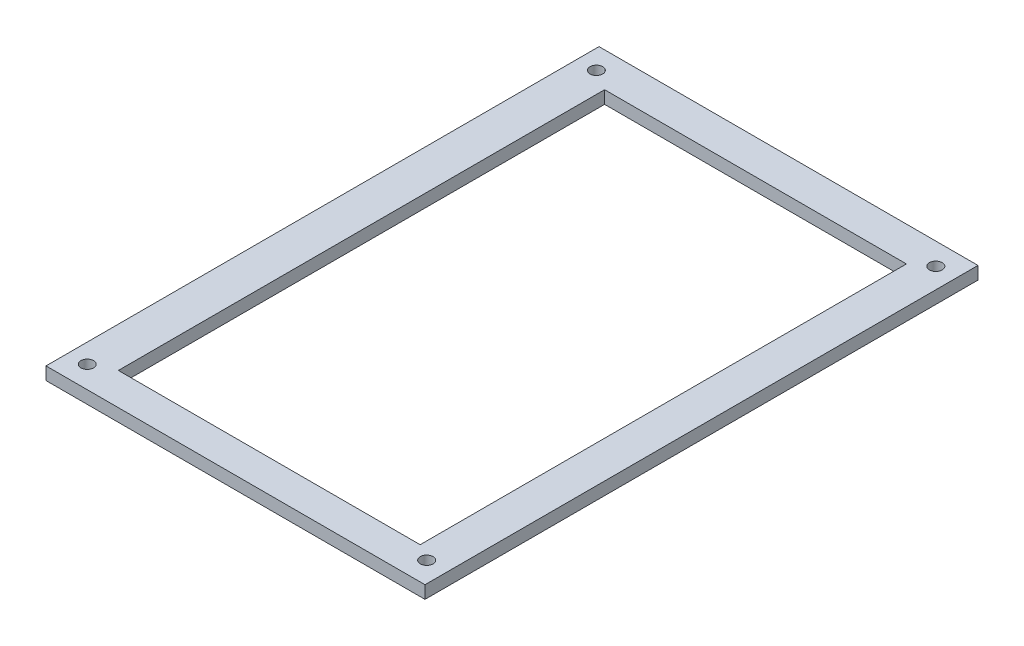
ISO-10303-21;
HEADER;
FILE_DESCRIPTION(('STEP AP214'),'2;1');
FILE_NAME('part.step','',(''),(''),'','','');
FILE_SCHEMA(('AUTOMOTIVE_DESIGN { 1 0 10303 214 1 1 1 1 }'));
ENDSEC;
DATA;
#1=APPLICATION_CONTEXT('core data for automotive mechanical design processes');
#2=APPLICATION_PROTOCOL_DEFINITION('international standard','automotive_design',2000,#1);
#3=PRODUCT_CONTEXT('',#1,'mechanical');
#4=PRODUCT('Part','Part','',(#3));
#5=PRODUCT_RELATED_PRODUCT_CATEGORY('part','',(#4));
#6=PRODUCT_DEFINITION_FORMATION('','',#4);
#7=PRODUCT_DEFINITION_CONTEXT('part definition',#1,'design');
#8=PRODUCT_DEFINITION('design','',#6,#7);
#9=PRODUCT_DEFINITION_SHAPE('','',#8);
#10=(LENGTH_UNIT() NAMED_UNIT(*) SI_UNIT(.MILLI.,.METRE.));
#11=(NAMED_UNIT(*) PLANE_ANGLE_UNIT() SI_UNIT($,.RADIAN.));
#12=(NAMED_UNIT(*) SI_UNIT($,.STERADIAN.) SOLID_ANGLE_UNIT());
#13=UNCERTAINTY_MEASURE_WITH_UNIT(LENGTH_MEASURE(1.E-05),#10,'distance_accuracy_value','');
#14=(GEOMETRIC_REPRESENTATION_CONTEXT(3) GLOBAL_UNCERTAINTY_ASSIGNED_CONTEXT((#13)) GLOBAL_UNIT_ASSIGNED_CONTEXT((#10,
#11,#12)) REPRESENTATION_CONTEXT('',''));
#15=CARTESIAN_POINT('',(0.,0.,0.));
#16=DIRECTION('',(0.,0.,1.));
#17=DIRECTION('',(1.,0.,0.));
#18=AXIS2_PLACEMENT_3D('',#15,#16,#17);
#19=CARTESIAN_POINT('',(0.,42.,0.));
#20=DIRECTION('',(0.,-1.,0.));
#21=DIRECTION('',(0.,0.,-1.));
#22=AXIS2_PLACEMENT_3D('',#19,#20,#21);
#23=PLANE('',#22);
#24=DIRECTION('',(1.,0.,0.));
#25=VECTOR('',#24,1.);
#26=CARTESIAN_POINT('',(13.4246740856766,42.,-63.4018424092195));
#27=LINE('',#26,#25);
#28=CARTESIAN_POINT('',(13.4246740856766,42.,-63.4018424092195));
#29=VERTEX_POINT('',#28);
#30=CARTESIAN_POINT('',(84.5608782991245,42.,-63.4018424092195));
#31=VERTEX_POINT('',#30);
#32=EDGE_CURVE('E228',#29,#31,#27,.T.);
#33=ORIENTED_EDGE('',*,*,#32,.F.);
#34=DIRECTION('',(0.,0.,1.));
#35=VECTOR('',#34,1.);
#36=CARTESIAN_POINT('',(13.4246740856766,42.,-178.010171419774));
#37=LINE('',#36,#35);
#38=CARTESIAN_POINT('',(13.4246740856766,42.,-178.010171419774));
#39=VERTEX_POINT('',#38);
#40=EDGE_CURVE('E169',#39,#29,#37,.T.);
#41=ORIENTED_EDGE('',*,*,#40,.F.);
#42=DIRECTION('',(-1.,0.,0.));
#43=VECTOR('',#42,1.);
#44=CARTESIAN_POINT('',(13.4246740856766,42.,-178.010171419774));
#45=LINE('',#44,#43);
#46=CARTESIAN_POINT('',(84.5608782991245,42.,-178.010171419774));
#47=VERTEX_POINT('',#46);
#48=EDGE_CURVE('E236',#47,#39,#45,.T.);
#49=ORIENTED_EDGE('',*,*,#48,.F.);
#50=DIRECTION('',(0.,0.,-1.));
#51=VECTOR('',#50,1.);
#52=CARTESIAN_POINT('',(84.5608782991245,42.,-178.010171419774));
#53=LINE('',#52,#51);
#54=EDGE_CURVE('E232',#31,#47,#53,.T.);
#55=ORIENTED_EDGE('',*,*,#54,.F.);
#56=EDGE_LOOP('',(#33,#41,#49,#55));
#57=FACE_BOUND('',#56,.T.);
#58=CARTESIAN_POINT('',(88.5,42.,-61.));
#59=DIRECTION('',(0.,1.,0.));
#60=DIRECTION('',(0.,0.,1.));
#61=AXIS2_PLACEMENT_3D('',#58,#59,#60);
#62=CIRCLE('',#61,1.5);
#63=CARTESIAN_POINT('',(88.5,42.,-59.5));
#64=VERTEX_POINT('',#63);
#65=EDGE_CURVE('E52',#64,#64,#62,.T.);
#66=ORIENTED_EDGE('',*,*,#65,.F.);
#67=EDGE_LOOP('',(#66));
#68=FACE_BOUND('',#67,.T.);
#69=CARTESIAN_POINT('',(8.49999999999999,42.,-181.));
#70=DIRECTION('',(0.,1.,0.));
#71=DIRECTION('',(0.,0.,1.));
#72=AXIS2_PLACEMENT_3D('',#69,#70,#71);
#73=CIRCLE('',#72,1.5);
#74=CARTESIAN_POINT('',(8.49999999999999,42.,-179.5));
#75=VERTEX_POINT('',#74);
#76=EDGE_CURVE('E142',#75,#75,#73,.T.);
#77=ORIENTED_EDGE('',*,*,#76,.F.);
#78=EDGE_LOOP('',(#77));
#79=FACE_BOUND('',#78,.T.);
#80=CARTESIAN_POINT('',(88.5,42.,-181.));
#81=DIRECTION('',(0.,1.,0.));
#82=DIRECTION('',(0.,0.,1.));
#83=AXIS2_PLACEMENT_3D('',#80,#81,#82);
#84=CIRCLE('',#83,1.5);
#85=CARTESIAN_POINT('',(88.5,42.,-179.5));
#86=VERTEX_POINT('',#85);
#87=EDGE_CURVE('E146',#86,#86,#84,.T.);
#88=ORIENTED_EDGE('',*,*,#87,.F.);
#89=EDGE_LOOP('',(#88));
#90=FACE_BOUND('',#89,.T.);
#91=CARTESIAN_POINT('',(8.49999999999999,42.,-61.));
#92=DIRECTION('',(0.,1.,0.));
#93=DIRECTION('',(0.,0.,1.));
#94=AXIS2_PLACEMENT_3D('',#91,#92,#93);
#95=CIRCLE('',#94,1.5);
#96=CARTESIAN_POINT('',(8.49999999999999,42.,-59.5));
#97=VERTEX_POINT('',#96);
#98=EDGE_CURVE('E153',#97,#97,#95,.T.);
#99=ORIENTED_EDGE('',*,*,#98,.F.);
#100=EDGE_LOOP('',(#99));
#101=FACE_BOUND('',#100,.T.);
#102=DIRECTION('',(0.,0.,1.));
#103=VECTOR('',#102,1.);
#104=CARTESIAN_POINT('',(3.97136320231542,42.,-186.145726622208));
#105=LINE('',#104,#103);
#106=CARTESIAN_POINT('',(3.97136320231542,42.,-186.145726622208));
#107=VERTEX_POINT('',#106);
#108=CARTESIAN_POINT('',(3.97136320231542,42.,-55.8051978447658));
#109=VERTEX_POINT('',#108);
#110=EDGE_CURVE('E185',#107,#109,#105,.T.);
#111=ORIENTED_EDGE('',*,*,#110,.T.);
#112=DIRECTION('',(1.,0.,0.));
#113=VECTOR('',#112,1.);
#114=CARTESIAN_POINT('',(3.97136320231542,42.,-55.8051978447658));
#115=LINE('',#114,#113);
#116=CARTESIAN_POINT('',(93.2956416651782,42.,-55.8051978447658));
#117=VERTEX_POINT('',#116);
#118=EDGE_CURVE('E127',#109,#117,#115,.T.);
#119=ORIENTED_EDGE('',*,*,#118,.T.);
#120=DIRECTION('',(0.,0.,-1.));
#121=VECTOR('',#120,1.);
#122=CARTESIAN_POINT('',(93.2956416651782,42.,-186.145726622208));
#123=LINE('',#122,#121);
#124=CARTESIAN_POINT('',(93.2956416651782,42.,-186.145726622208));
#125=VERTEX_POINT('',#124);
#126=EDGE_CURVE('E138',#117,#125,#123,.T.);
#127=ORIENTED_EDGE('',*,*,#126,.T.);
#128=DIRECTION('',(-1.,0.,0.));
#129=VECTOR('',#128,1.);
#130=CARTESIAN_POINT('',(3.97136320231542,42.,-186.145726622208));
#131=LINE('',#130,#129);
#132=EDGE_CURVE('E131',#125,#107,#131,.T.);
#133=ORIENTED_EDGE('',*,*,#132,.T.);
#134=EDGE_LOOP('',(#111,#119,#127,#133));
#135=FACE_BOUND('',#134,.T.);
#136=ADVANCED_FACE('F44',(#57,#68,#79,#90,#101,#135),#23,.F.);
#137=CARTESIAN_POINT('',(88.5,39.,-61.));
#138=DIRECTION('',(0.,1.,0.));
#139=DIRECTION('',(0.,0.,1.));
#140=AXIS2_PLACEMENT_3D('',#137,#138,#139);
#141=CYLINDRICAL_SURFACE('',#140,1.5);
#142=CARTESIAN_POINT('',(88.5,39.,-61.));
#143=DIRECTION('',(0.,1.,0.));
#144=DIRECTION('',(0.,0.,1.));
#145=AXIS2_PLACEMENT_3D('',#142,#143,#144);
#146=CIRCLE('',#145,1.5);
#147=CARTESIAN_POINT('',(88.5,39.,-59.5));
#148=VERTEX_POINT('',#147);
#149=EDGE_CURVE('E151',#148,#148,#146,.T.);
#150=ORIENTED_EDGE('',*,*,#149,.F.);
#151=EDGE_LOOP('',(#150));
#152=FACE_BOUND('',#151,.T.);
#153=ORIENTED_EDGE('',*,*,#65,.T.);
#154=EDGE_LOOP('',(#153));
#155=FACE_BOUND('',#154,.T.);
#156=ADVANCED_FACE('F174',(#152,#155),#141,.F.);
#157=CARTESIAN_POINT('',(8.49999999999999,39.,-181.));
#158=DIRECTION('',(0.,1.,0.));
#159=DIRECTION('',(0.,0.,1.));
#160=AXIS2_PLACEMENT_3D('',#157,#158,#159);
#161=CYLINDRICAL_SURFACE('',#160,1.5);
#162=CARTESIAN_POINT('',(8.49999999999999,39.,-181.));
#163=DIRECTION('',(0.,1.,0.));
#164=DIRECTION('',(0.,0.,1.));
#165=AXIS2_PLACEMENT_3D('',#162,#163,#164);
#166=CIRCLE('',#165,1.5);
#167=CARTESIAN_POINT('',(8.49999999999999,39.,-179.5));
#168=VERTEX_POINT('',#167);
#169=EDGE_CURVE('E147',#168,#168,#166,.T.);
#170=ORIENTED_EDGE('',*,*,#169,.F.);
#171=EDGE_LOOP('',(#170));
#172=FACE_BOUND('',#171,.T.);
#173=ORIENTED_EDGE('',*,*,#76,.T.);
#174=EDGE_LOOP('',(#173));
#175=FACE_BOUND('',#174,.T.);
#176=ADVANCED_FACE('F284',(#172,#175),#161,.F.);
#177=CARTESIAN_POINT('',(88.5,39.,-181.));
#178=DIRECTION('',(0.,1.,0.));
#179=DIRECTION('',(0.,0.,1.));
#180=AXIS2_PLACEMENT_3D('',#177,#178,#179);
#181=CYLINDRICAL_SURFACE('',#180,1.5);
#182=CARTESIAN_POINT('',(88.5,39.,-181.));
#183=DIRECTION('',(0.,1.,0.));
#184=DIRECTION('',(0.,0.,1.));
#185=AXIS2_PLACEMENT_3D('',#182,#183,#184);
#186=CIRCLE('',#185,1.5);
#187=CARTESIAN_POINT('',(88.5,39.,-179.5));
#188=VERTEX_POINT('',#187);
#189=EDGE_CURVE('E152',#188,#188,#186,.T.);
#190=ORIENTED_EDGE('',*,*,#189,.F.);
#191=EDGE_LOOP('',(#190));
#192=FACE_BOUND('',#191,.T.);
#193=ORIENTED_EDGE('',*,*,#87,.T.);
#194=EDGE_LOOP('',(#193));
#195=FACE_BOUND('',#194,.T.);
#196=ADVANCED_FACE('F287',(#192,#195),#181,.F.);
#197=CARTESIAN_POINT('',(8.49999999999999,39.,-61.));
#198=DIRECTION('',(0.,1.,0.));
#199=DIRECTION('',(0.,0.,1.));
#200=AXIS2_PLACEMENT_3D('',#197,#198,#199);
#201=CYLINDRICAL_SURFACE('',#200,1.5);
#202=CARTESIAN_POINT('',(8.49999999999999,39.,-61.));
#203=DIRECTION('',(0.,1.,0.));
#204=DIRECTION('',(0.,0.,1.));
#205=AXIS2_PLACEMENT_3D('',#202,#203,#204);
#206=CIRCLE('',#205,1.5);
#207=CARTESIAN_POINT('',(8.49999999999999,39.,-59.5));
#208=VERTEX_POINT('',#207);
#209=EDGE_CURVE('E157',#208,#208,#206,.T.);
#210=ORIENTED_EDGE('',*,*,#209,.F.);
#211=EDGE_LOOP('',(#210));
#212=FACE_BOUND('',#211,.T.);
#213=ORIENTED_EDGE('',*,*,#98,.T.);
#214=EDGE_LOOP('',(#213));
#215=FACE_BOUND('',#214,.T.);
#216=ADVANCED_FACE('F283',(#212,#215),#201,.F.);
#217=CARTESIAN_POINT('',(3.97136320231542,0.,-186.145726622208));
#218=DIRECTION('',(-1.,0.,0.));
#219=DIRECTION('',(0.,0.,1.));
#220=AXIS2_PLACEMENT_3D('',#217,#218,#219);
#221=PLANE('',#220);
#222=DIRECTION('',(0.,0.,-1.));
#223=VECTOR('',#222,1.);
#224=CARTESIAN_POINT('',(3.97136320231542,39.,-55.8051978447658));
#225=LINE('',#224,#223);
#226=CARTESIAN_POINT('',(3.97136320231542,39.,-55.8051978447658));
#227=VERTEX_POINT('',#226);
#228=CARTESIAN_POINT('',(3.97136320231542,39.,-186.145726622208));
#229=VERTEX_POINT('',#228);
#230=EDGE_CURVE('E108',#227,#229,#225,.T.);
#231=ORIENTED_EDGE('',*,*,#230,.F.);
#232=DIRECTION('',(0.,1.,0.));
#233=VECTOR('',#232,1.);
#234=CARTESIAN_POINT('',(3.97136320231542,0.,-55.8051978447658));
#235=LINE('',#234,#233);
#236=EDGE_CURVE('E120',#227,#109,#235,.T.);
#237=ORIENTED_EDGE('',*,*,#236,.T.);
#238=ORIENTED_EDGE('',*,*,#110,.F.);
#239=DIRECTION('',(0.,1.,0.));
#240=VECTOR('',#239,1.);
#241=CARTESIAN_POINT('',(3.97136320231542,0.,-186.145726622208));
#242=LINE('',#241,#240);
#243=EDGE_CURVE('E122',#229,#107,#242,.T.);
#244=ORIENTED_EDGE('',*,*,#243,.F.);
#245=EDGE_LOOP('',(#231,#237,#238,#244));
#246=FACE_BOUND('',#245,.T.);
#247=ADVANCED_FACE('F118',(#246),#221,.T.);
#248=CARTESIAN_POINT('',(3.97136320231542,0.,-186.145726622208));
#249=DIRECTION('',(0.,0.,-1.));
#250=DIRECTION('',(-1.,0.,0.));
#251=AXIS2_PLACEMENT_3D('',#248,#249,#250);
#252=PLANE('',#251);
#253=DIRECTION('',(1.,0.,0.));
#254=VECTOR('',#253,1.);
#255=CARTESIAN_POINT('',(93.2956416651782,39.,-186.145726622208));
#256=LINE('',#255,#254);
#257=CARTESIAN_POINT('',(93.2956416651782,39.,-186.145726622208));
#258=VERTEX_POINT('',#257);
#259=EDGE_CURVE('E114',#229,#258,#256,.T.);
#260=ORIENTED_EDGE('',*,*,#259,.F.);
#261=ORIENTED_EDGE('',*,*,#243,.T.);
#262=ORIENTED_EDGE('',*,*,#132,.F.);
#263=DIRECTION('',(0.,1.,0.));
#264=VECTOR('',#263,1.);
#265=CARTESIAN_POINT('',(93.2956416651782,0.,-186.145726622208));
#266=LINE('',#265,#264);
#267=EDGE_CURVE('E135',#258,#125,#266,.T.);
#268=ORIENTED_EDGE('',*,*,#267,.F.);
#269=EDGE_LOOP('',(#260,#261,#262,#268));
#270=FACE_BOUND('',#269,.T.);
#271=ADVANCED_FACE('F209',(#270),#252,.T.);
#272=CARTESIAN_POINT('',(93.2956416651782,0.,-186.145726622208));
#273=DIRECTION('',(1.,0.,0.));
#274=DIRECTION('',(0.,0.,-1.));
#275=AXIS2_PLACEMENT_3D('',#272,#273,#274);
#276=PLANE('',#275);
#277=DIRECTION('',(0.,0.,-1.));
#278=VECTOR('',#277,1.);
#279=CARTESIAN_POINT('',(93.2956416651782,39.,-55.8051978447658));
#280=LINE('',#279,#278);
#281=CARTESIAN_POINT('',(93.2956416651782,39.,-55.8051978447658));
#282=VERTEX_POINT('',#281);
#283=EDGE_CURVE('E59',#282,#258,#280,.T.);
#284=ORIENTED_EDGE('',*,*,#283,.T.);
#285=ORIENTED_EDGE('',*,*,#267,.T.);
#286=ORIENTED_EDGE('',*,*,#126,.F.);
#287=DIRECTION('',(0.,1.,0.));
#288=VECTOR('',#287,1.);
#289=CARTESIAN_POINT('',(93.2956416651782,0.,-55.8051978447658));
#290=LINE('',#289,#288);
#291=EDGE_CURVE('E130',#282,#117,#290,.T.);
#292=ORIENTED_EDGE('',*,*,#291,.F.);
#293=EDGE_LOOP('',(#284,#285,#286,#292));
#294=FACE_BOUND('',#293,.T.);
#295=ADVANCED_FACE('F207',(#294),#276,.T.);
#296=CARTESIAN_POINT('',(3.97136320231542,0.,-55.8051978447658));
#297=DIRECTION('',(0.,0.,1.));
#298=DIRECTION('',(1.,0.,0.));
#299=AXIS2_PLACEMENT_3D('',#296,#297,#298);
#300=PLANE('',#299);
#301=DIRECTION('',(1.,0.,0.));
#302=VECTOR('',#301,1.);
#303=CARTESIAN_POINT('',(93.2956416651782,39.,-55.8051978447658));
#304=LINE('',#303,#302);
#305=EDGE_CURVE('E105',#227,#282,#304,.T.);
#306=ORIENTED_EDGE('',*,*,#305,.T.);
#307=ORIENTED_EDGE('',*,*,#291,.T.);
#308=ORIENTED_EDGE('',*,*,#118,.F.);
#309=ORIENTED_EDGE('',*,*,#236,.F.);
#310=EDGE_LOOP('',(#306,#307,#308,#309));
#311=FACE_BOUND('',#310,.T.);
#312=ADVANCED_FACE('F125',(#311),#300,.T.);
#313=CARTESIAN_POINT('',(13.4246740856766,0.,-178.010171419774));
#314=DIRECTION('',(-1.,0.,0.));
#315=DIRECTION('',(0.,0.,1.));
#316=AXIS2_PLACEMENT_3D('',#313,#314,#315);
#317=PLANE('',#316);
#318=DIRECTION('',(0.,1.,0.));
#319=VECTOR('',#318,1.);
#320=CARTESIAN_POINT('',(13.4246740856766,0.,-63.4018424092195));
#321=LINE('',#320,#319);
#322=CARTESIAN_POINT('',(13.4246740856766,39.,-63.4018424092195));
#323=VERTEX_POINT('',#322);
#324=EDGE_CURVE('E197',#323,#29,#321,.T.);
#325=ORIENTED_EDGE('',*,*,#324,.F.);
#326=DIRECTION('',(0.,0.,-1.));
#327=VECTOR('',#326,1.);
#328=CARTESIAN_POINT('',(13.4246740856766,39.,-178.010171419774));
#329=LINE('',#328,#327);
#330=CARTESIAN_POINT('',(13.4246740856766,39.,-178.010171419774));
#331=VERTEX_POINT('',#330);
#332=EDGE_CURVE('E67',#323,#331,#329,.T.);
#333=ORIENTED_EDGE('',*,*,#332,.T.);
#334=DIRECTION('',(0.,1.,0.));
#335=VECTOR('',#334,1.);
#336=CARTESIAN_POINT('',(13.4246740856766,0.,-178.010171419774));
#337=LINE('',#336,#335);
#338=EDGE_CURVE('E189',#331,#39,#337,.T.);
#339=ORIENTED_EDGE('',*,*,#338,.T.);
#340=ORIENTED_EDGE('',*,*,#40,.T.);
#341=EDGE_LOOP('',(#325,#333,#339,#340));
#342=FACE_BOUND('',#341,.T.);
#343=ADVANCED_FACE('F253',(#342),#317,.F.);
#344=CARTESIAN_POINT('',(13.4246740856766,0.,-178.010171419774));
#345=DIRECTION('',(0.,0.,-1.));
#346=DIRECTION('',(-1.,0.,0.));
#347=AXIS2_PLACEMENT_3D('',#344,#345,#346);
#348=PLANE('',#347);
#349=ORIENTED_EDGE('',*,*,#338,.F.);
#350=DIRECTION('',(1.,0.,0.));
#351=VECTOR('',#350,1.);
#352=CARTESIAN_POINT('',(13.4246740856766,39.,-178.010171419774));
#353=LINE('',#352,#351);
#354=CARTESIAN_POINT('',(84.5608782991245,39.,-178.010171419774));
#355=VERTEX_POINT('',#354);
#356=EDGE_CURVE('E219',#331,#355,#353,.T.);
#357=ORIENTED_EDGE('',*,*,#356,.T.);
#358=DIRECTION('',(0.,1.,0.));
#359=VECTOR('',#358,1.);
#360=CARTESIAN_POINT('',(84.5608782991245,0.,-178.010171419774));
#361=LINE('',#360,#359);
#362=EDGE_CURVE('E194',#355,#47,#361,.T.);
#363=ORIENTED_EDGE('',*,*,#362,.T.);
#364=ORIENTED_EDGE('',*,*,#48,.T.);
#365=EDGE_LOOP('',(#349,#357,#363,#364));
#366=FACE_BOUND('',#365,.T.);
#367=ADVANCED_FACE('F259',(#366),#348,.F.);
#368=CARTESIAN_POINT('',(84.5608782991245,0.,-178.010171419774));
#369=DIRECTION('',(1.,0.,0.));
#370=DIRECTION('',(0.,0.,-1.));
#371=AXIS2_PLACEMENT_3D('',#368,#369,#370);
#372=PLANE('',#371);
#373=ORIENTED_EDGE('',*,*,#362,.F.);
#374=DIRECTION('',(0.,0.,1.));
#375=VECTOR('',#374,1.);
#376=CARTESIAN_POINT('',(84.5608782991245,39.,-178.010171419774));
#377=LINE('',#376,#375);
#378=CARTESIAN_POINT('',(84.5608782991245,39.,-63.4018424092195));
#379=VERTEX_POINT('',#378);
#380=EDGE_CURVE('E214',#355,#379,#377,.T.);
#381=ORIENTED_EDGE('',*,*,#380,.T.);
#382=DIRECTION('',(0.,1.,0.));
#383=VECTOR('',#382,1.);
#384=CARTESIAN_POINT('',(84.5608782991245,0.,-63.4018424092195));
#385=LINE('',#384,#383);
#386=EDGE_CURVE('E241',#379,#31,#385,.T.);
#387=ORIENTED_EDGE('',*,*,#386,.T.);
#388=ORIENTED_EDGE('',*,*,#54,.T.);
#389=EDGE_LOOP('',(#373,#381,#387,#388));
#390=FACE_BOUND('',#389,.T.);
#391=ADVANCED_FACE('F257',(#390),#372,.F.);
#392=CARTESIAN_POINT('',(13.4246740856766,0.,-63.4018424092195));
#393=DIRECTION('',(0.,0.,1.));
#394=DIRECTION('',(1.,0.,0.));
#395=AXIS2_PLACEMENT_3D('',#392,#393,#394);
#396=PLANE('',#395);
#397=ORIENTED_EDGE('',*,*,#386,.F.);
#398=DIRECTION('',(-1.,0.,0.));
#399=VECTOR('',#398,1.);
#400=CARTESIAN_POINT('',(13.4246740856766,39.,-63.4018424092195));
#401=LINE('',#400,#399);
#402=EDGE_CURVE('E11',#379,#323,#401,.T.);
#403=ORIENTED_EDGE('',*,*,#402,.T.);
#404=ORIENTED_EDGE('',*,*,#324,.T.);
#405=ORIENTED_EDGE('',*,*,#32,.T.);
#406=EDGE_LOOP('',(#397,#403,#404,#405));
#407=FACE_BOUND('',#406,.T.);
#408=ADVANCED_FACE('F248',(#407),#396,.F.);
#409=CARTESIAN_POINT('',(93.2956416651782,39.,-55.8051978447658));
#410=DIRECTION('',(0.,1.,0.));
#411=DIRECTION('',(0.,0.,1.));
#412=AXIS2_PLACEMENT_3D('',#409,#410,#411);
#413=PLANE('',#412);
#414=ORIENTED_EDGE('',*,*,#149,.T.);
#415=EDGE_LOOP('',(#414));
#416=FACE_BOUND('',#415,.T.);
#417=ORIENTED_EDGE('',*,*,#169,.T.);
#418=EDGE_LOOP('',(#417));
#419=FACE_BOUND('',#418,.T.);
#420=ORIENTED_EDGE('',*,*,#189,.T.);
#421=EDGE_LOOP('',(#420));
#422=FACE_BOUND('',#421,.T.);
#423=ORIENTED_EDGE('',*,*,#209,.T.);
#424=EDGE_LOOP('',(#423));
#425=FACE_BOUND('',#424,.T.);
#426=ORIENTED_EDGE('',*,*,#259,.T.);
#427=ORIENTED_EDGE('',*,*,#283,.F.);
#428=ORIENTED_EDGE('',*,*,#305,.F.);
#429=ORIENTED_EDGE('',*,*,#230,.T.);
#430=EDGE_LOOP('',(#426,#427,#428,#429));
#431=FACE_BOUND('',#430,.T.);
#432=ORIENTED_EDGE('',*,*,#402,.F.);
#433=ORIENTED_EDGE('',*,*,#380,.F.);
#434=ORIENTED_EDGE('',*,*,#356,.F.);
#435=ORIENTED_EDGE('',*,*,#332,.F.);
#436=EDGE_LOOP('',(#432,#433,#434,#435));
#437=FACE_BOUND('',#436,.T.);
#438=ADVANCED_FACE('F107',(#416,#419,#422,#425,#431,#437),#413,.F.);
#439=CLOSED_SHELL('',(#136,#156,#176,#196,#216,#247,#271,#295,#312,#343,#367,#391,#408,#438));
#440=MANIFOLD_SOLID_BREP('B2',#439);
#441=ADVANCED_BREP_SHAPE_REPRESENTATION('',(#18,#440),#14);
#442=SHAPE_DEFINITION_REPRESENTATION(#9,#441);
ENDSEC;
END-ISO-10303-21;
